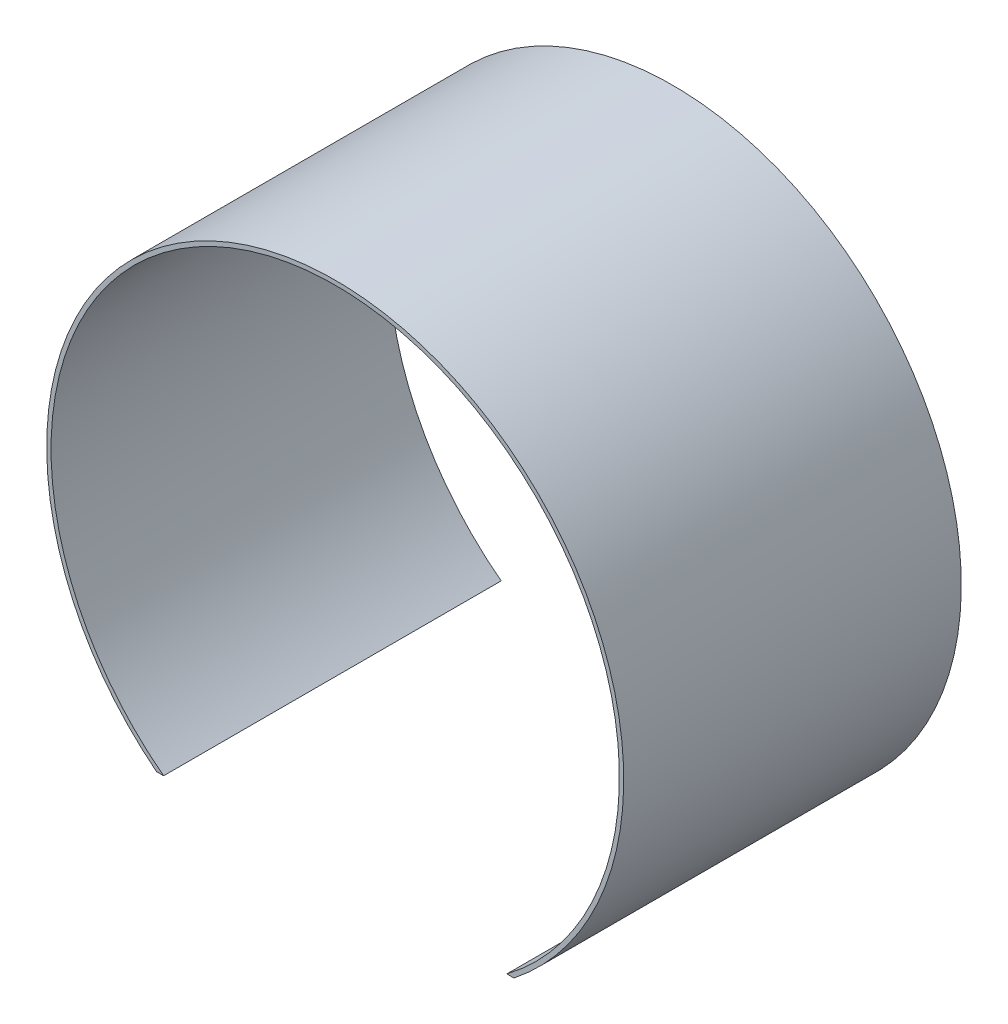
ISO-10303-21;
HEADER;
FILE_DESCRIPTION(('STEP AP214'),'2;1');
FILE_NAME('part.step','',(''),(''),'','','');
FILE_SCHEMA(('AUTOMOTIVE_DESIGN { 1 0 10303 214 1 1 1 1 }'));
ENDSEC;
DATA;
#1=APPLICATION_CONTEXT('core data for automotive mechanical design processes');
#2=APPLICATION_PROTOCOL_DEFINITION('international standard','automotive_design',2000,#1);
#3=PRODUCT_CONTEXT('',#1,'mechanical');
#4=PRODUCT('Part','Part','',(#3));
#5=PRODUCT_RELATED_PRODUCT_CATEGORY('part','',(#4));
#6=PRODUCT_DEFINITION_FORMATION('','',#4);
#7=PRODUCT_DEFINITION_CONTEXT('part definition',#1,'design');
#8=PRODUCT_DEFINITION('design','',#6,#7);
#9=PRODUCT_DEFINITION_SHAPE('','',#8);
#10=(LENGTH_UNIT() NAMED_UNIT(*) SI_UNIT(.MILLI.,.METRE.));
#11=(NAMED_UNIT(*) PLANE_ANGLE_UNIT() SI_UNIT($,.RADIAN.));
#12=(NAMED_UNIT(*) SI_UNIT($,.STERADIAN.) SOLID_ANGLE_UNIT());
#13=UNCERTAINTY_MEASURE_WITH_UNIT(LENGTH_MEASURE(1.E-05),#10,'distance_accuracy_value','');
#14=(GEOMETRIC_REPRESENTATION_CONTEXT(3) GLOBAL_UNCERTAINTY_ASSIGNED_CONTEXT((#13)) GLOBAL_UNIT_ASSIGNED_CONTEXT((#10,
#11,#12)) REPRESENTATION_CONTEXT('',''));
#15=CARTESIAN_POINT('',(0.,0.,0.));
#16=DIRECTION('',(0.,0.,1.));
#17=DIRECTION('',(1.,0.,0.));
#18=AXIS2_PLACEMENT_3D('',#15,#16,#17);
#19=CARTESIAN_POINT('',(0.,0.,117.));
#20=DIRECTION('',(0.,0.,-1.));
#21=DIRECTION('',(-1.,0.,0.));
#22=AXIS2_PLACEMENT_3D('',#19,#20,#21);
#23=CYLINDRICAL_SURFACE('',#22,100.);
#24=CARTESIAN_POINT('',(0.,0.,0.));
#25=DIRECTION('',(0.,0.,1.));
#26=DIRECTION('',(1.,0.,0.));
#27=AXIS2_PLACEMENT_3D('',#24,#25,#26);
#28=CIRCLE('',#27,100.);
#29=CARTESIAN_POINT('',(61.9276306742176,-78.5173137535774,0.));
#30=VERTEX_POINT('',#29);
#31=CARTESIAN_POINT('',(-61.927630674217,-78.5173137535778,0.));
#32=VERTEX_POINT('',#31);
#33=EDGE_CURVE('E96',#30,#32,#28,.T.);
#34=ORIENTED_EDGE('',*,*,#33,.T.);
#35=DIRECTION('',(0.,0.,-1.));
#36=VECTOR('',#35,1.);
#37=CARTESIAN_POINT('',(-61.927630674217,-78.5173137535778,117.));
#38=LINE('',#37,#36);
#39=CARTESIAN_POINT('',(-61.927630674217,-78.5173137535778,117.));
#40=VERTEX_POINT('',#39);
#41=EDGE_CURVE('E11',#40,#32,#38,.T.);
#42=ORIENTED_EDGE('',*,*,#41,.F.);
#43=CARTESIAN_POINT('',(0.,0.,117.));
#44=DIRECTION('',(0.,0.,1.));
#45=DIRECTION('',(1.,0.,0.));
#46=AXIS2_PLACEMENT_3D('',#43,#44,#45);
#47=CIRCLE('',#46,100.);
#48=CARTESIAN_POINT('',(61.9276306742176,-78.5173137535774,117.));
#49=VERTEX_POINT('',#48);
#50=EDGE_CURVE('E84',#49,#40,#47,.T.);
#51=ORIENTED_EDGE('',*,*,#50,.F.);
#52=DIRECTION('',(0.,0.,-1.));
#53=VECTOR('',#52,1.);
#54=CARTESIAN_POINT('',(61.9276306742176,-78.5173137535774,117.));
#55=LINE('',#54,#53);
#56=EDGE_CURVE('E92',#49,#30,#55,.T.);
#57=ORIENTED_EDGE('',*,*,#56,.T.);
#58=EDGE_LOOP('',(#34,#42,#51,#57));
#59=FACE_BOUND('',#58,.T.);
#60=ADVANCED_FACE('F33',(#59),#23,.T.);
#61=CARTESIAN_POINT('',(-61.927630674217,-78.5173137535778,117.));
#62=DIRECTION('',(0.,1.,0.));
#63=DIRECTION('',(0.,0.,1.));
#64=AXIS2_PLACEMENT_3D('',#61,#62,#63);
#65=PLANE('',#64);
#66=DIRECTION('',(1.,0.,0.));
#67=VECTOR('',#66,1.);
#68=CARTESIAN_POINT('',(-61.927630674217,-78.5173137535778,0.));
#69=LINE('',#68,#67);
#70=CARTESIAN_POINT('',(-59.4750488938195,-78.5173137535778,0.));
#71=VERTEX_POINT('',#70);
#72=EDGE_CURVE('E88',#32,#71,#69,.T.);
#73=ORIENTED_EDGE('',*,*,#72,.T.);
#74=DIRECTION('',(0.,0.,-1.));
#75=VECTOR('',#74,1.);
#76=CARTESIAN_POINT('',(-59.4750488938195,-78.5173137535778,117.));
#77=LINE('',#76,#75);
#78=CARTESIAN_POINT('',(-59.4750488938195,-78.5173137535778,117.));
#79=VERTEX_POINT('',#78);
#80=EDGE_CURVE('E41',#79,#71,#77,.T.);
#81=ORIENTED_EDGE('',*,*,#80,.F.);
#82=DIRECTION('',(1.,0.,0.));
#83=VECTOR('',#82,1.);
#84=CARTESIAN_POINT('',(-61.927630674217,-78.5173137535778,117.));
#85=LINE('',#84,#83);
#86=EDGE_CURVE('E79',#40,#79,#85,.T.);
#87=ORIENTED_EDGE('',*,*,#86,.F.);
#88=ORIENTED_EDGE('',*,*,#41,.T.);
#89=EDGE_LOOP('',(#73,#81,#87,#88));
#90=FACE_BOUND('',#89,.T.);
#91=ADVANCED_FACE('F87',(#90),#65,.F.);
#92=CARTESIAN_POINT('',(0.,0.,117.));
#93=DIRECTION('',(0.,0.,-1.));
#94=DIRECTION('',(-1.,0.,0.));
#95=AXIS2_PLACEMENT_3D('',#92,#93,#94);
#96=CYLINDRICAL_SURFACE('',#95,98.5);
#97=CARTESIAN_POINT('',(0.,0.,0.));
#98=DIRECTION('',(0.,0.,-1.));
#99=DIRECTION('',(1.,0.,0.));
#100=AXIS2_PLACEMENT_3D('',#97,#98,#99);
#101=CIRCLE('',#100,98.5);
#102=CARTESIAN_POINT('',(59.4750488938201,-78.5173137535774,0.));
#103=VERTEX_POINT('',#102);
#104=EDGE_CURVE('E66',#71,#103,#101,.T.);
#105=ORIENTED_EDGE('',*,*,#104,.T.);
#106=DIRECTION('',(0.,0.,-1.));
#107=VECTOR('',#106,1.);
#108=CARTESIAN_POINT('',(59.4750488938201,-78.5173137535774,117.));
#109=LINE('',#108,#107);
#110=CARTESIAN_POINT('',(59.4750488938201,-78.5173137535774,117.));
#111=VERTEX_POINT('',#110);
#112=EDGE_CURVE('E89',#111,#103,#109,.T.);
#113=ORIENTED_EDGE('',*,*,#112,.F.);
#114=CARTESIAN_POINT('',(0.,0.,117.));
#115=DIRECTION('',(0.,0.,-1.));
#116=DIRECTION('',(1.,0.,0.));
#117=AXIS2_PLACEMENT_3D('',#114,#115,#116);
#118=CIRCLE('',#117,98.5);
#119=EDGE_CURVE('E82',#79,#111,#118,.T.);
#120=ORIENTED_EDGE('',*,*,#119,.F.);
#121=ORIENTED_EDGE('',*,*,#80,.T.);
#122=EDGE_LOOP('',(#105,#113,#120,#121));
#123=FACE_BOUND('',#122,.T.);
#124=ADVANCED_FACE('F90',(#123),#96,.F.);
#125=CARTESIAN_POINT('',(59.4750488938201,-78.5173137535774,117.));
#126=DIRECTION('',(0.,1.,0.));
#127=DIRECTION('',(0.,0.,1.));
#128=AXIS2_PLACEMENT_3D('',#125,#126,#127);
#129=PLANE('',#128);
#130=DIRECTION('',(1.,0.,0.));
#131=VECTOR('',#130,1.);
#132=CARTESIAN_POINT('',(59.4750488938201,-78.5173137535774,0.));
#133=LINE('',#132,#131);
#134=EDGE_CURVE('E72',#103,#30,#133,.T.);
#135=ORIENTED_EDGE('',*,*,#134,.T.);
#136=ORIENTED_EDGE('',*,*,#56,.F.);
#137=DIRECTION('',(1.,0.,0.));
#138=VECTOR('',#137,1.);
#139=CARTESIAN_POINT('',(59.4750488938201,-78.5173137535774,117.));
#140=LINE('',#139,#138);
#141=EDGE_CURVE('E49',#111,#49,#140,.T.);
#142=ORIENTED_EDGE('',*,*,#141,.F.);
#143=ORIENTED_EDGE('',*,*,#112,.T.);
#144=EDGE_LOOP('',(#135,#136,#142,#143));
#145=FACE_BOUND('',#144,.T.);
#146=ADVANCED_FACE('F103',(#145),#129,.F.);
#147=CARTESIAN_POINT('',(0.,0.,117.));
#148=DIRECTION('',(0.,0.,1.));
#149=DIRECTION('',(1.,0.,0.));
#150=AXIS2_PLACEMENT_3D('',#147,#148,#149);
#151=PLANE('',#150);
#152=ORIENTED_EDGE('',*,*,#50,.T.);
#153=ORIENTED_EDGE('',*,*,#86,.T.);
#154=ORIENTED_EDGE('',*,*,#119,.T.);
#155=ORIENTED_EDGE('',*,*,#141,.T.);
#156=EDGE_LOOP('',(#152,#153,#154,#155));
#157=FACE_BOUND('',#156,.T.);
#158=ADVANCED_FACE('F80',(#157),#151,.T.);
#159=CARTESIAN_POINT('',(0.,0.,0.));
#160=DIRECTION('',(0.,0.,1.));
#161=DIRECTION('',(1.,0.,0.));
#162=AXIS2_PLACEMENT_3D('',#159,#160,#161);
#163=PLANE('',#162);
#164=ORIENTED_EDGE('',*,*,#33,.F.);
#165=ORIENTED_EDGE('',*,*,#134,.F.);
#166=ORIENTED_EDGE('',*,*,#104,.F.);
#167=ORIENTED_EDGE('',*,*,#72,.F.);
#168=EDGE_LOOP('',(#164,#165,#166,#167));
#169=FACE_BOUND('',#168,.T.);
#170=ADVANCED_FACE('F106',(#169),#163,.F.);
#171=CLOSED_SHELL('',(#60,#91,#124,#146,#158,#170));
#172=MANIFOLD_SOLID_BREP('B2',#171);
#173=ADVANCED_BREP_SHAPE_REPRESENTATION('',(#18,#172),#14);
#174=SHAPE_DEFINITION_REPRESENTATION(#9,#173);
ENDSEC;
END-ISO-10303-21;
